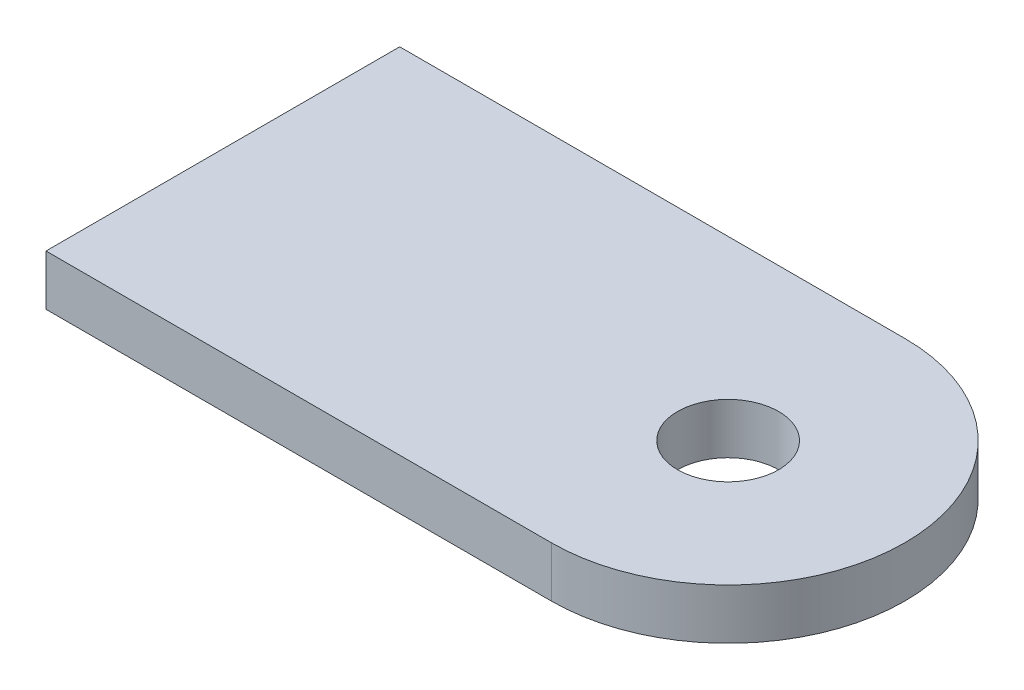
ISO-10303-21;
HEADER;
FILE_DESCRIPTION(('STEP AP214'),'2;1');
FILE_NAME('part.step','',(''),(''),'','','');
FILE_SCHEMA(('AUTOMOTIVE_DESIGN { 1 0 10303 214 1 1 1 1 }'));
ENDSEC;
DATA;
#1=APPLICATION_CONTEXT('core data for automotive mechanical design processes');
#2=APPLICATION_PROTOCOL_DEFINITION('international standard','automotive_design',2000,#1);
#3=PRODUCT_CONTEXT('',#1,'mechanical');
#4=PRODUCT('Part','Part','',(#3));
#5=PRODUCT_RELATED_PRODUCT_CATEGORY('part','',(#4));
#6=PRODUCT_DEFINITION_FORMATION('','',#4);
#7=PRODUCT_DEFINITION_CONTEXT('part definition',#1,'design');
#8=PRODUCT_DEFINITION('design','',#6,#7);
#9=PRODUCT_DEFINITION_SHAPE('','',#8);
#10=(LENGTH_UNIT() NAMED_UNIT(*) SI_UNIT(.MILLI.,.METRE.));
#11=(NAMED_UNIT(*) PLANE_ANGLE_UNIT() SI_UNIT($,.RADIAN.));
#12=(NAMED_UNIT(*) SI_UNIT($,.STERADIAN.) SOLID_ANGLE_UNIT());
#13=UNCERTAINTY_MEASURE_WITH_UNIT(LENGTH_MEASURE(1.E-05),#10,'distance_accuracy_value','');
#14=(GEOMETRIC_REPRESENTATION_CONTEXT(3) GLOBAL_UNCERTAINTY_ASSIGNED_CONTEXT((#13)) GLOBAL_UNIT_ASSIGNED_CONTEXT((#10,
#11,#12)) REPRESENTATION_CONTEXT('',''));
#15=CARTESIAN_POINT('',(0.,0.,0.));
#16=DIRECTION('',(0.,0.,1.));
#17=DIRECTION('',(1.,0.,0.));
#18=AXIS2_PLACEMENT_3D('',#15,#16,#17);
#19=CARTESIAN_POINT('',(1.,0.1,-0.35));
#20=DIRECTION('',(0.,-1.,0.));
#21=DIRECTION('',(0.,0.,-1.));
#22=AXIS2_PLACEMENT_3D('',#19,#20,#21);
#23=PLANE('',#22);
#24=DIRECTION('',(1.,0.,0.));
#25=VECTOR('',#24,1.);
#26=CARTESIAN_POINT('',(0.,0.1,0.));
#27=LINE('',#26,#25);
#28=CARTESIAN_POINT('',(0.,0.1,0.));
#29=VERTEX_POINT('',#28);
#30=CARTESIAN_POINT('',(1.,0.1,0.));
#31=VERTEX_POINT('',#30);
#32=EDGE_CURVE('E92',#29,#31,#27,.T.);
#33=ORIENTED_EDGE('',*,*,#32,.T.);
#34=CARTESIAN_POINT('',(1.,0.1,-0.35));
#35=DIRECTION('',(0.,1.,0.));
#36=DIRECTION('',(0.,0.,-1.));
#37=AXIS2_PLACEMENT_3D('',#34,#35,#36);
#38=CIRCLE('',#37,0.35);
#39=CARTESIAN_POINT('',(1.,0.1,-0.7));
#40=VERTEX_POINT('',#39);
#41=EDGE_CURVE('E87',#31,#40,#38,.T.);
#42=ORIENTED_EDGE('',*,*,#41,.T.);
#43=DIRECTION('',(-1.,0.,0.));
#44=VECTOR('',#43,1.);
#45=CARTESIAN_POINT('',(0.,0.1,-0.7));
#46=LINE('',#45,#44);
#47=CARTESIAN_POINT('',(0.,0.1,-0.7));
#48=VERTEX_POINT('',#47);
#49=EDGE_CURVE('E90',#40,#48,#46,.T.);
#50=ORIENTED_EDGE('',*,*,#49,.T.);
#51=DIRECTION('',(0.,0.,1.));
#52=VECTOR('',#51,1.);
#53=CARTESIAN_POINT('',(0.,0.1,0.));
#54=LINE('',#53,#52);
#55=EDGE_CURVE('E57',#48,#29,#54,.T.);
#56=ORIENTED_EDGE('',*,*,#55,.T.);
#57=EDGE_LOOP('',(#33,#42,#50,#56));
#58=FACE_BOUND('',#57,.T.);
#59=CARTESIAN_POINT('',(1.,0.1,-0.35));
#60=DIRECTION('',(0.,1.,0.));
#61=DIRECTION('',(0.,0.,1.));
#62=AXIS2_PLACEMENT_3D('',#59,#60,#61);
#63=CIRCLE('',#62,0.1);
#64=CARTESIAN_POINT('',(1.,0.1,-0.25));
#65=VERTEX_POINT('',#64);
#66=EDGE_CURVE('E112',#65,#65,#63,.T.);
#67=ORIENTED_EDGE('',*,*,#66,.F.);
#68=EDGE_LOOP('',(#67));
#69=FACE_BOUND('',#68,.T.);
#70=ADVANCED_FACE('F39',(#58,#69),#23,.F.);
#71=CARTESIAN_POINT('',(1.,0.,-0.35));
#72=DIRECTION('',(0.,-1.,0.));
#73=DIRECTION('',(0.,0.,-1.));
#74=AXIS2_PLACEMENT_3D('',#71,#72,#73);
#75=PLANE('',#74);
#76=DIRECTION('',(1.,0.,0.));
#77=VECTOR('',#76,1.);
#78=CARTESIAN_POINT('',(0.,0.,0.));
#79=LINE('',#78,#77);
#80=CARTESIAN_POINT('',(0.,0.,0.));
#81=VERTEX_POINT('',#80);
#82=CARTESIAN_POINT('',(1.,0.,0.));
#83=VERTEX_POINT('',#82);
#84=EDGE_CURVE('E108',#81,#83,#79,.T.);
#85=ORIENTED_EDGE('',*,*,#84,.F.);
#86=DIRECTION('',(0.,0.,1.));
#87=VECTOR('',#86,1.);
#88=CARTESIAN_POINT('',(0.,0.,0.));
#89=LINE('',#88,#87);
#90=CARTESIAN_POINT('',(0.,0.,-0.7));
#91=VERTEX_POINT('',#90);
#92=EDGE_CURVE('E80',#91,#81,#89,.T.);
#93=ORIENTED_EDGE('',*,*,#92,.F.);
#94=DIRECTION('',(-1.,0.,0.));
#95=VECTOR('',#94,1.);
#96=CARTESIAN_POINT('',(0.,0.,-0.7));
#97=LINE('',#96,#95);
#98=CARTESIAN_POINT('',(1.,0.,-0.7));
#99=VERTEX_POINT('',#98);
#100=EDGE_CURVE('E74',#99,#91,#97,.T.);
#101=ORIENTED_EDGE('',*,*,#100,.F.);
#102=CARTESIAN_POINT('',(1.,0.,-0.35));
#103=DIRECTION('',(0.,1.,0.));
#104=DIRECTION('',(0.,0.,-1.));
#105=AXIS2_PLACEMENT_3D('',#102,#103,#104);
#106=CIRCLE('',#105,0.35);
#107=EDGE_CURVE('E97',#83,#99,#106,.T.);
#108=ORIENTED_EDGE('',*,*,#107,.F.);
#109=EDGE_LOOP('',(#85,#93,#101,#108));
#110=FACE_BOUND('',#109,.T.);
#111=CARTESIAN_POINT('',(1.,0.,-0.35));
#112=DIRECTION('',(0.,1.,0.));
#113=DIRECTION('',(0.,0.,1.));
#114=AXIS2_PLACEMENT_3D('',#111,#112,#113);
#115=CIRCLE('',#114,0.1);
#116=CARTESIAN_POINT('',(1.,0.,-0.25));
#117=VERTEX_POINT('',#116);
#118=EDGE_CURVE('E130',#117,#117,#115,.T.);
#119=ORIENTED_EDGE('',*,*,#118,.T.);
#120=EDGE_LOOP('',(#119));
#121=FACE_BOUND('',#120,.T.);
#122=ADVANCED_FACE('F125',(#110,#121),#75,.T.);
#123=CARTESIAN_POINT('',(0.,0.1,0.));
#124=DIRECTION('',(0.,0.,-1.));
#125=DIRECTION('',(-1.,0.,0.));
#126=AXIS2_PLACEMENT_3D('',#123,#124,#125);
#127=PLANE('',#126);
#128=ORIENTED_EDGE('',*,*,#84,.T.);
#129=DIRECTION('',(0.,-1.,0.));
#130=VECTOR('',#129,1.);
#131=CARTESIAN_POINT('',(1.,0.1,0.));
#132=LINE('',#131,#130);
#133=EDGE_CURVE('E11',#31,#83,#132,.T.);
#134=ORIENTED_EDGE('',*,*,#133,.F.);
#135=ORIENTED_EDGE('',*,*,#32,.F.);
#136=DIRECTION('',(0.,-1.,0.));
#137=VECTOR('',#136,1.);
#138=CARTESIAN_POINT('',(0.,0.1,0.));
#139=LINE('',#138,#137);
#140=EDGE_CURVE('E104',#29,#81,#139,.T.);
#141=ORIENTED_EDGE('',*,*,#140,.T.);
#142=EDGE_LOOP('',(#128,#134,#135,#141));
#143=FACE_BOUND('',#142,.T.);
#144=ADVANCED_FACE('F41',(#143),#127,.F.);
#145=CARTESIAN_POINT('',(1.,0.1,-0.35));
#146=DIRECTION('',(0.,-1.,0.));
#147=DIRECTION('',(0.,0.,-1.));
#148=AXIS2_PLACEMENT_3D('',#145,#146,#147);
#149=CYLINDRICAL_SURFACE('',#148,0.35);
#150=ORIENTED_EDGE('',*,*,#107,.T.);
#151=DIRECTION('',(0.,-1.,0.));
#152=VECTOR('',#151,1.);
#153=CARTESIAN_POINT('',(1.,0.1,-0.7));
#154=LINE('',#153,#152);
#155=EDGE_CURVE('E49',#40,#99,#154,.T.);
#156=ORIENTED_EDGE('',*,*,#155,.F.);
#157=ORIENTED_EDGE('',*,*,#41,.F.);
#158=ORIENTED_EDGE('',*,*,#133,.T.);
#159=EDGE_LOOP('',(#150,#156,#157,#158));
#160=FACE_BOUND('',#159,.T.);
#161=ADVANCED_FACE('F96',(#160),#149,.T.);
#162=CARTESIAN_POINT('',(0.,0.1,-0.7));
#163=DIRECTION('',(0.,0.,1.));
#164=DIRECTION('',(1.,0.,0.));
#165=AXIS2_PLACEMENT_3D('',#162,#163,#164);
#166=PLANE('',#165);
#167=ORIENTED_EDGE('',*,*,#100,.T.);
#168=DIRECTION('',(0.,-1.,0.));
#169=VECTOR('',#168,1.);
#170=CARTESIAN_POINT('',(0.,0.1,-0.7));
#171=LINE('',#170,#169);
#172=EDGE_CURVE('E99',#48,#91,#171,.T.);
#173=ORIENTED_EDGE('',*,*,#172,.F.);
#174=ORIENTED_EDGE('',*,*,#49,.F.);
#175=ORIENTED_EDGE('',*,*,#155,.T.);
#176=EDGE_LOOP('',(#167,#173,#174,#175));
#177=FACE_BOUND('',#176,.T.);
#178=ADVANCED_FACE('F100',(#177),#166,.F.);
#179=CARTESIAN_POINT('',(0.,0.1,0.));
#180=DIRECTION('',(1.,0.,0.));
#181=DIRECTION('',(0.,0.,-1.));
#182=AXIS2_PLACEMENT_3D('',#179,#180,#181);
#183=PLANE('',#182);
#184=ORIENTED_EDGE('',*,*,#92,.T.);
#185=ORIENTED_EDGE('',*,*,#140,.F.);
#186=ORIENTED_EDGE('',*,*,#55,.F.);
#187=ORIENTED_EDGE('',*,*,#172,.T.);
#188=EDGE_LOOP('',(#184,#185,#186,#187));
#189=FACE_BOUND('',#188,.T.);
#190=ADVANCED_FACE('F122',(#189),#183,.F.);
#191=CARTESIAN_POINT('',(1.,0.1,-0.35));
#192=DIRECTION('',(0.,-1.,0.));
#193=DIRECTION('',(0.,0.,-1.));
#194=AXIS2_PLACEMENT_3D('',#191,#192,#193);
#195=CYLINDRICAL_SURFACE('',#194,0.1);
#196=ORIENTED_EDGE('',*,*,#66,.T.);
#197=EDGE_LOOP('',(#196));
#198=FACE_BOUND('',#197,.T.);
#199=ORIENTED_EDGE('',*,*,#118,.F.);
#200=EDGE_LOOP('',(#199));
#201=FACE_BOUND('',#200,.T.);
#202=ADVANCED_FACE('F138',(#198,#201),#195,.F.);
#203=CLOSED_SHELL('',(#70,#122,#144,#161,#178,#190,#202));
#204=MANIFOLD_SOLID_BREP('B2',#203);
#205=ADVANCED_BREP_SHAPE_REPRESENTATION('',(#18,#204),#14);
#206=SHAPE_DEFINITION_REPRESENTATION(#9,#205);
ENDSEC;
END-ISO-10303-21;
